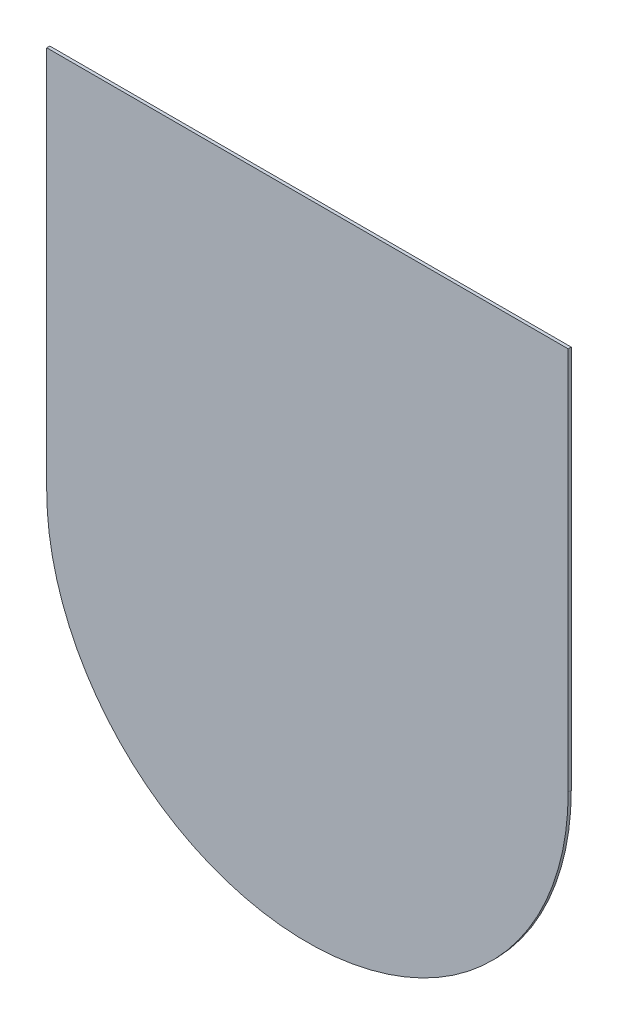
ISO-10303-21;
HEADER;
FILE_DESCRIPTION(('STEP AP214'),'2;1');
FILE_NAME('part.step','',(''),(''),'','','');
FILE_SCHEMA(('AUTOMOTIVE_DESIGN { 1 0 10303 214 1 1 1 1 }'));
ENDSEC;
DATA;
#1=APPLICATION_CONTEXT('core data for automotive mechanical design processes');
#2=APPLICATION_PROTOCOL_DEFINITION('international standard','automotive_design',2000,#1);
#3=PRODUCT_CONTEXT('',#1,'mechanical');
#4=PRODUCT('Part','Part','',(#3));
#5=PRODUCT_RELATED_PRODUCT_CATEGORY('part','',(#4));
#6=PRODUCT_DEFINITION_FORMATION('','',#4);
#7=PRODUCT_DEFINITION_CONTEXT('part definition',#1,'design');
#8=PRODUCT_DEFINITION('design','',#6,#7);
#9=PRODUCT_DEFINITION_SHAPE('','',#8);
#10=(LENGTH_UNIT() NAMED_UNIT(*) SI_UNIT(.MILLI.,.METRE.));
#11=(NAMED_UNIT(*) PLANE_ANGLE_UNIT() SI_UNIT($,.RADIAN.));
#12=(NAMED_UNIT(*) SI_UNIT($,.STERADIAN.) SOLID_ANGLE_UNIT());
#13=UNCERTAINTY_MEASURE_WITH_UNIT(LENGTH_MEASURE(1.E-05),#10,'distance_accuracy_value','');
#14=(GEOMETRIC_REPRESENTATION_CONTEXT(3) GLOBAL_UNCERTAINTY_ASSIGNED_CONTEXT((#13)) GLOBAL_UNIT_ASSIGNED_CONTEXT((#10,
#11,#12)) REPRESENTATION_CONTEXT('',''));
#15=CARTESIAN_POINT('',(0.,0.,0.));
#16=DIRECTION('',(0.,0.,1.));
#17=DIRECTION('',(1.,0.,0.));
#18=AXIS2_PLACEMENT_3D('',#15,#16,#17);
#19=CARTESIAN_POINT('',(0.,0.,-2.));
#20=DIRECTION('',(0.,0.,1.));
#21=DIRECTION('',(1.,0.,0.));
#22=AXIS2_PLACEMENT_3D('',#19,#20,#21);
#23=CYLINDRICAL_SURFACE('',#22,169.866523099859);
#24=CARTESIAN_POINT('',(0.,0.,0.));
#25=DIRECTION('',(0.,0.,1.));
#26=DIRECTION('',(1.,0.,0.));
#27=AXIS2_PLACEMENT_3D('',#24,#25,#26);
#28=CIRCLE('',#27,169.866523099859);
#29=CARTESIAN_POINT('',(-169.866523099859,0.,0.));
#30=VERTEX_POINT('',#29);
#31=CARTESIAN_POINT('',(169.866523099859,0.,0.));
#32=VERTEX_POINT('',#31);
#33=EDGE_CURVE('E100',#30,#32,#28,.T.);
#34=ORIENTED_EDGE('',*,*,#33,.F.);
#35=DIRECTION('',(0.,0.,1.));
#36=VECTOR('',#35,1.);
#37=CARTESIAN_POINT('',(-169.866523099859,0.,-2.));
#38=LINE('',#37,#36);
#39=CARTESIAN_POINT('',(-169.866523099859,0.,-2.));
#40=VERTEX_POINT('',#39);
#41=EDGE_CURVE('E11',#40,#30,#38,.T.);
#42=ORIENTED_EDGE('',*,*,#41,.F.);
#43=CARTESIAN_POINT('',(0.,0.,-2.));
#44=DIRECTION('',(0.,0.,1.));
#45=DIRECTION('',(1.,0.,0.));
#46=AXIS2_PLACEMENT_3D('',#43,#44,#45);
#47=CIRCLE('',#46,169.866523099859);
#48=CARTESIAN_POINT('',(169.866523099859,0.,-2.));
#49=VERTEX_POINT('',#48);
#50=EDGE_CURVE('E94',#40,#49,#47,.T.);
#51=ORIENTED_EDGE('',*,*,#50,.T.);
#52=DIRECTION('',(0.,0.,1.));
#53=VECTOR('',#52,1.);
#54=CARTESIAN_POINT('',(169.866523099859,0.,-2.));
#55=LINE('',#54,#53);
#56=EDGE_CURVE('E39',#49,#32,#55,.T.);
#57=ORIENTED_EDGE('',*,*,#56,.T.);
#58=EDGE_LOOP('',(#34,#42,#51,#57));
#59=FACE_BOUND('',#58,.T.);
#60=ADVANCED_FACE('F36',(#59),#23,.T.);
#61=CARTESIAN_POINT('',(-169.866523099859,250.,-2.));
#62=DIRECTION('',(-1.,0.,0.));
#63=DIRECTION('',(0.,0.,1.));
#64=AXIS2_PLACEMENT_3D('',#61,#62,#63);
#65=PLANE('',#64);
#66=DIRECTION('',(0.,-1.,0.));
#67=VECTOR('',#66,1.);
#68=CARTESIAN_POINT('',(-169.866523099859,250.,0.));
#69=LINE('',#68,#67);
#70=CARTESIAN_POINT('',(-169.866523099859,250.,0.));
#71=VERTEX_POINT('',#70);
#72=EDGE_CURVE('E96',#71,#30,#69,.T.);
#73=ORIENTED_EDGE('',*,*,#72,.F.);
#74=DIRECTION('',(0.,0.,1.));
#75=VECTOR('',#74,1.);
#76=CARTESIAN_POINT('',(-169.866523099859,250.,-2.));
#77=LINE('',#76,#75);
#78=CARTESIAN_POINT('',(-169.866523099859,250.,-2.));
#79=VERTEX_POINT('',#78);
#80=EDGE_CURVE('E45',#79,#71,#77,.T.);
#81=ORIENTED_EDGE('',*,*,#80,.F.);
#82=DIRECTION('',(0.,-1.,0.));
#83=VECTOR('',#82,1.);
#84=CARTESIAN_POINT('',(-169.866523099859,250.,-2.));
#85=LINE('',#84,#83);
#86=EDGE_CURVE('E91',#79,#40,#85,.T.);
#87=ORIENTED_EDGE('',*,*,#86,.T.);
#88=ORIENTED_EDGE('',*,*,#41,.T.);
#89=EDGE_LOOP('',(#73,#81,#87,#88));
#90=FACE_BOUND('',#89,.T.);
#91=ADVANCED_FACE('F110',(#90),#65,.T.);
#92=CARTESIAN_POINT('',(169.866523099859,250.,-2.));
#93=DIRECTION('',(0.,1.,0.));
#94=DIRECTION('',(0.,0.,1.));
#95=AXIS2_PLACEMENT_3D('',#92,#93,#94);
#96=PLANE('',#95);
#97=DIRECTION('',(-1.,0.,0.));
#98=VECTOR('',#97,1.);
#99=CARTESIAN_POINT('',(169.866523099859,250.,0.));
#100=LINE('',#99,#98);
#101=CARTESIAN_POINT('',(169.866523099859,250.,0.));
#102=VERTEX_POINT('',#101);
#103=EDGE_CURVE('E86',#102,#71,#100,.T.);
#104=ORIENTED_EDGE('',*,*,#103,.F.);
#105=DIRECTION('',(0.,0.,1.));
#106=VECTOR('',#105,1.);
#107=CARTESIAN_POINT('',(169.866523099859,250.,-2.));
#108=LINE('',#107,#106);
#109=CARTESIAN_POINT('',(169.866523099859,250.,-2.));
#110=VERTEX_POINT('',#109);
#111=EDGE_CURVE('E81',#110,#102,#108,.T.);
#112=ORIENTED_EDGE('',*,*,#111,.F.);
#113=DIRECTION('',(-1.,0.,0.));
#114=VECTOR('',#113,1.);
#115=CARTESIAN_POINT('',(169.866523099859,250.,-2.));
#116=LINE('',#115,#114);
#117=EDGE_CURVE('E84',#110,#79,#116,.T.);
#118=ORIENTED_EDGE('',*,*,#117,.T.);
#119=ORIENTED_EDGE('',*,*,#80,.T.);
#120=EDGE_LOOP('',(#104,#112,#118,#119));
#121=FACE_BOUND('',#120,.T.);
#122=ADVANCED_FACE('F83',(#121),#96,.T.);
#123=CARTESIAN_POINT('',(169.866523099859,250.,-2.));
#124=DIRECTION('',(1.,0.,0.));
#125=DIRECTION('',(0.,0.,-1.));
#126=AXIS2_PLACEMENT_3D('',#123,#124,#125);
#127=PLANE('',#126);
#128=DIRECTION('',(0.,1.,0.));
#129=VECTOR('',#128,1.);
#130=CARTESIAN_POINT('',(169.866523099859,250.,0.));
#131=LINE('',#130,#129);
#132=EDGE_CURVE('E103',#32,#102,#131,.T.);
#133=ORIENTED_EDGE('',*,*,#132,.F.);
#134=ORIENTED_EDGE('',*,*,#56,.F.);
#135=DIRECTION('',(0.,1.,0.));
#136=VECTOR('',#135,1.);
#137=CARTESIAN_POINT('',(169.866523099859,250.,-2.));
#138=LINE('',#137,#136);
#139=EDGE_CURVE('E90',#49,#110,#138,.T.);
#140=ORIENTED_EDGE('',*,*,#139,.T.);
#141=ORIENTED_EDGE('',*,*,#111,.T.);
#142=EDGE_LOOP('',(#133,#134,#140,#141));
#143=FACE_BOUND('',#142,.T.);
#144=ADVANCED_FACE('F93',(#143),#127,.T.);
#145=CARTESIAN_POINT('',(0.,0.,-2.));
#146=DIRECTION('',(0.,0.,1.));
#147=DIRECTION('',(1.,0.,0.));
#148=AXIS2_PLACEMENT_3D('',#145,#146,#147);
#149=PLANE('',#148);
#150=ORIENTED_EDGE('',*,*,#50,.F.);
#151=ORIENTED_EDGE('',*,*,#86,.F.);
#152=ORIENTED_EDGE('',*,*,#117,.F.);
#153=ORIENTED_EDGE('',*,*,#139,.F.);
#154=EDGE_LOOP('',(#150,#151,#152,#153));
#155=FACE_BOUND('',#154,.T.);
#156=ADVANCED_FACE('F89',(#155),#149,.F.);
#157=CARTESIAN_POINT('',(0.,0.,0.));
#158=DIRECTION('',(0.,0.,1.));
#159=DIRECTION('',(1.,0.,0.));
#160=AXIS2_PLACEMENT_3D('',#157,#158,#159);
#161=PLANE('',#160);
#162=ORIENTED_EDGE('',*,*,#33,.T.);
#163=ORIENTED_EDGE('',*,*,#132,.T.);
#164=ORIENTED_EDGE('',*,*,#103,.T.);
#165=ORIENTED_EDGE('',*,*,#72,.T.);
#166=EDGE_LOOP('',(#162,#163,#164,#165));
#167=FACE_BOUND('',#166,.T.);
#168=ADVANCED_FACE('F109',(#167),#161,.T.);
#169=CLOSED_SHELL('',(#60,#91,#122,#144,#156,#168));
#170=MANIFOLD_SOLID_BREP('B2',#169);
#171=ADVANCED_BREP_SHAPE_REPRESENTATION('',(#18,#170),#14);
#172=SHAPE_DEFINITION_REPRESENTATION(#9,#171);
ENDSEC;
END-ISO-10303-21;
